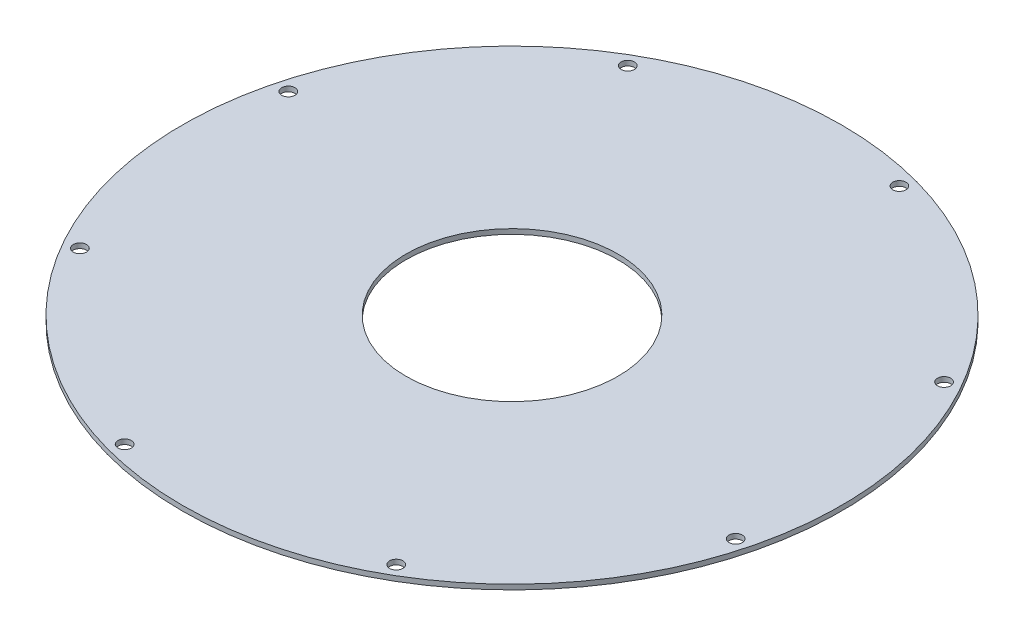
ISO-10303-21;
HEADER;
FILE_DESCRIPTION(('STEP AP214'),'2;1');
FILE_NAME('part.step','',(''),(''),'','','');
FILE_SCHEMA(('AUTOMOTIVE_DESIGN { 1 0 10303 214 1 1 1 1 }'));
ENDSEC;
DATA;
#1=APPLICATION_CONTEXT('core data for automotive mechanical design processes');
#2=APPLICATION_PROTOCOL_DEFINITION('international standard','automotive_design',2000,#1);
#3=PRODUCT_CONTEXT('',#1,'mechanical');
#4=PRODUCT('Part','Part','',(#3));
#5=PRODUCT_RELATED_PRODUCT_CATEGORY('part','',(#4));
#6=PRODUCT_DEFINITION_FORMATION('','',#4);
#7=PRODUCT_DEFINITION_CONTEXT('part definition',#1,'design');
#8=PRODUCT_DEFINITION('design','',#6,#7);
#9=PRODUCT_DEFINITION_SHAPE('','',#8);
#10=(LENGTH_UNIT() NAMED_UNIT(*) SI_UNIT(.MILLI.,.METRE.));
#11=(NAMED_UNIT(*) PLANE_ANGLE_UNIT() SI_UNIT($,.RADIAN.));
#12=(NAMED_UNIT(*) SI_UNIT($,.STERADIAN.) SOLID_ANGLE_UNIT());
#13=UNCERTAINTY_MEASURE_WITH_UNIT(LENGTH_MEASURE(1.E-05),#10,'distance_accuracy_value','');
#14=(GEOMETRIC_REPRESENTATION_CONTEXT(3) GLOBAL_UNCERTAINTY_ASSIGNED_CONTEXT((#13)) GLOBAL_UNIT_ASSIGNED_CONTEXT((#10,
#11,#12)) REPRESENTATION_CONTEXT('',''));
#15=CARTESIAN_POINT('',(0.,0.,0.));
#16=DIRECTION('',(0.,0.,1.));
#17=DIRECTION('',(1.,0.,0.));
#18=AXIS2_PLACEMENT_3D('',#15,#16,#17);
#19=CARTESIAN_POINT('',(0.,0.75,0.));
#20=DIRECTION('',(0.,1.,0.));
#21=DIRECTION('',(0.,0.,1.));
#22=AXIS2_PLACEMENT_3D('',#19,#20,#21);
#23=PLANE('',#22);
#24=CARTESIAN_POINT('',(-47.7500000000007,0.75,-82.7054260614135));
#25=DIRECTION('',(0.,1.,0.));
#26=DIRECTION('',(0.707106781186549,0.,0.707106781186546));
#27=AXIS2_PLACEMENT_3D('',#24,#25,#26);
#28=CIRCLE('',#27,1.99999999999998);
#29=CARTESIAN_POINT('',(-46.3357864376276,0.75,-81.2912124990404));
#30=VERTEX_POINT('',#29);
#31=EDGE_CURVE('E98',#30,#30,#28,.T.);
#32=ORIENTED_EDGE('',*,*,#31,.F.);
#33=EDGE_LOOP('',(#32));
#34=FACE_BOUND('',#33,.T.);
#35=CARTESIAN_POINT('',(-92.2459164106063,0.75,-24.7172188072898));
#36=DIRECTION('',(0.,1.,0.));
#37=DIRECTION('',(1.,0.,0.));
#38=AXIS2_PLACEMENT_3D('',#35,#36,#37);
#39=CIRCLE('',#38,1.99999999999998);
#40=CARTESIAN_POINT('',(-90.2459164106063,0.75,-24.7172188072898));
#41=VERTEX_POINT('',#40);
#42=EDGE_CURVE('E92',#41,#41,#39,.T.);
#43=ORIENTED_EDGE('',*,*,#42,.F.);
#44=EDGE_LOOP('',(#43));
#45=FACE_BOUND('',#44,.T.);
#46=CARTESIAN_POINT('',(-82.7054260614133,0.75,47.750000000001));
#47=DIRECTION('',(0.,1.,0.));
#48=DIRECTION('',(0.707106781186544,0.,-0.707106781186551));
#49=AXIS2_PLACEMENT_3D('',#46,#47,#48);
#50=CIRCLE('',#49,1.99999999999998);
#51=CARTESIAN_POINT('',(-81.2912124990403,0.75,46.3357864376279));
#52=VERTEX_POINT('',#51);
#53=EDGE_CURVE('E86',#52,#52,#50,.T.);
#54=ORIENTED_EDGE('',*,*,#53,.F.);
#55=EDGE_LOOP('',(#54));
#56=FACE_BOUND('',#55,.T.);
#57=CARTESIAN_POINT('',(-24.7172188072901,0.75,92.2459164106062));
#58=DIRECTION('',(0.,1.,0.));
#59=DIRECTION('',(0.,0.,-1.));
#60=AXIS2_PLACEMENT_3D('',#57,#58,#59);
#61=CIRCLE('',#60,1.99999999999998);
#62=CARTESIAN_POINT('',(-24.7172188072901,0.75,90.2459164106062));
#63=VERTEX_POINT('',#62);
#64=EDGE_CURVE('E80',#63,#63,#61,.T.);
#65=ORIENTED_EDGE('',*,*,#64,.F.);
#66=EDGE_LOOP('',(#65));
#67=FACE_BOUND('',#66,.T.);
#68=CARTESIAN_POINT('',(47.7500000000013,0.75,82.7054260614131));
#69=DIRECTION('',(0.,1.,0.));
#70=DIRECTION('',(-0.707106781186554,0.,-0.707106781186541));
#71=AXIS2_PLACEMENT_3D('',#68,#69,#70);
#72=CIRCLE('',#71,1.99999999999998);
#73=CARTESIAN_POINT('',(46.3357864376282,0.75,81.2912124990401));
#74=VERTEX_POINT('',#73);
#75=EDGE_CURVE('E74',#74,#74,#72,.T.);
#76=ORIENTED_EDGE('',*,*,#75,.F.);
#77=EDGE_LOOP('',(#76));
#78=FACE_BOUND('',#77,.T.);
#79=CARTESIAN_POINT('',(92.2459164106065,0.75,24.7172188072892));
#80=DIRECTION('',(0.,1.,0.));
#81=DIRECTION('',(-1.,0.,0.));
#82=AXIS2_PLACEMENT_3D('',#79,#80,#81);
#83=CIRCLE('',#82,1.99999999999998);
#84=CARTESIAN_POINT('',(90.2459164106065,0.75,24.7172188072892));
#85=VERTEX_POINT('',#84);
#86=EDGE_CURVE('E68',#85,#85,#83,.T.);
#87=ORIENTED_EDGE('',*,*,#86,.F.);
#88=EDGE_LOOP('',(#87));
#89=FACE_BOUND('',#88,.T.);
#90=CARTESIAN_POINT('',(82.705426061413,0.75,-47.7500000000016));
#91=DIRECTION('',(0.,1.,0.));
#92=DIRECTION('',(-0.707106781186539,0.,0.707106781186556));
#93=AXIS2_PLACEMENT_3D('',#90,#91,#92);
#94=CIRCLE('',#93,1.99999999999998);
#95=CARTESIAN_POINT('',(81.2912124990399,0.75,-46.3357864376285));
#96=VERTEX_POINT('',#95);
#97=EDGE_CURVE('E62',#96,#96,#94,.T.);
#98=ORIENTED_EDGE('',*,*,#97,.F.);
#99=EDGE_LOOP('',(#98));
#100=FACE_BOUND('',#99,.T.);
#101=CARTESIAN_POINT('',(24.7172188072901,0.75,-92.2459164106062));
#102=DIRECTION('',(0.,1.,0.));
#103=DIRECTION('',(0.,0.,1.));
#104=AXIS2_PLACEMENT_3D('',#101,#102,#103);
#105=CIRCLE('',#104,1.99999999999998);
#106=CARTESIAN_POINT('',(24.7172188072901,0.75,-90.2459164106062));
#107=VERTEX_POINT('',#106);
#108=EDGE_CURVE('E56',#107,#107,#105,.T.);
#109=ORIENTED_EDGE('',*,*,#108,.F.);
#110=EDGE_LOOP('',(#109));
#111=FACE_BOUND('',#110,.T.);
#112=CARTESIAN_POINT('',(0.,0.75,0.));
#113=DIRECTION('',(0.,1.,0.));
#114=DIRECTION('',(0.,0.,1.));
#115=AXIS2_PLACEMENT_3D('',#112,#113,#114);
#116=CIRCLE('',#115,99.5);
#117=CARTESIAN_POINT('',(0.,0.75,99.5));
#118=VERTEX_POINT('',#117);
#119=EDGE_CURVE('E10',#118,#118,#116,.T.);
#120=ORIENTED_EDGE('',*,*,#119,.T.);
#121=EDGE_LOOP('',(#120));
#122=FACE_BOUND('',#121,.T.);
#123=CARTESIAN_POINT('',(0.,0.75,0.));
#124=DIRECTION('',(0.,1.,0.));
#125=DIRECTION('',(0.,0.,1.));
#126=AXIS2_PLACEMENT_3D('',#123,#124,#125);
#127=CIRCLE('',#126,32.);
#128=CARTESIAN_POINT('',(0.,0.75,32.));
#129=VERTEX_POINT('',#128);
#130=EDGE_CURVE('E48',#129,#129,#127,.T.);
#131=ORIENTED_EDGE('',*,*,#130,.F.);
#132=EDGE_LOOP('',(#131));
#133=FACE_BOUND('',#132,.T.);
#134=ADVANCED_FACE('F37',(#34,#45,#56,#67,#78,#89,#100,#111,#122,#133),#23,.T.);
#135=CARTESIAN_POINT('',(0.,-0.75,0.));
#136=DIRECTION('',(0.,1.,0.));
#137=DIRECTION('',(0.,0.,1.));
#138=AXIS2_PLACEMENT_3D('',#135,#136,#137);
#139=PLANE('',#138);
#140=CARTESIAN_POINT('',(-47.7500000000007,-0.75,-82.7054260614135));
#141=DIRECTION('',(0.,1.,0.));
#142=DIRECTION('',(0.707106781186549,0.,0.707106781186546));
#143=AXIS2_PLACEMENT_3D('',#140,#141,#142);
#144=CIRCLE('',#143,1.99999999999998);
#145=CARTESIAN_POINT('',(-46.3357864376276,-0.75,-81.2912124990404));
#146=VERTEX_POINT('',#145);
#147=EDGE_CURVE('E59',#146,#146,#144,.T.);
#148=ORIENTED_EDGE('',*,*,#147,.T.);
#149=EDGE_LOOP('',(#148));
#150=FACE_BOUND('',#149,.T.);
#151=CARTESIAN_POINT('',(-92.2459164106063,-0.75,-24.7172188072898));
#152=DIRECTION('',(0.,1.,0.));
#153=DIRECTION('',(1.,0.,0.));
#154=AXIS2_PLACEMENT_3D('',#151,#152,#153);
#155=CIRCLE('',#154,1.99999999999998);
#156=CARTESIAN_POINT('',(-90.2459164106063,-0.75,-24.7172188072898));
#157=VERTEX_POINT('',#156);
#158=EDGE_CURVE('E95',#157,#157,#155,.T.);
#159=ORIENTED_EDGE('',*,*,#158,.T.);
#160=EDGE_LOOP('',(#159));
#161=FACE_BOUND('',#160,.T.);
#162=CARTESIAN_POINT('',(-82.7054260614133,-0.75,47.750000000001));
#163=DIRECTION('',(0.,1.,0.));
#164=DIRECTION('',(0.707106781186544,0.,-0.707106781186551));
#165=AXIS2_PLACEMENT_3D('',#162,#163,#164);
#166=CIRCLE('',#165,1.99999999999998);
#167=CARTESIAN_POINT('',(-81.2912124990403,-0.75,46.3357864376279));
#168=VERTEX_POINT('',#167);
#169=EDGE_CURVE('E89',#168,#168,#166,.T.);
#170=ORIENTED_EDGE('',*,*,#169,.T.);
#171=EDGE_LOOP('',(#170));
#172=FACE_BOUND('',#171,.T.);
#173=CARTESIAN_POINT('',(-24.7172188072901,-0.75,92.2459164106062));
#174=DIRECTION('',(0.,1.,0.));
#175=DIRECTION('',(0.,0.,-1.));
#176=AXIS2_PLACEMENT_3D('',#173,#174,#175);
#177=CIRCLE('',#176,1.99999999999998);
#178=CARTESIAN_POINT('',(-24.7172188072901,-0.75,90.2459164106062));
#179=VERTEX_POINT('',#178);
#180=EDGE_CURVE('E83',#179,#179,#177,.T.);
#181=ORIENTED_EDGE('',*,*,#180,.T.);
#182=EDGE_LOOP('',(#181));
#183=FACE_BOUND('',#182,.T.);
#184=CARTESIAN_POINT('',(47.7500000000013,-0.75,82.7054260614131));
#185=DIRECTION('',(0.,1.,0.));
#186=DIRECTION('',(-0.707106781186554,0.,-0.707106781186541));
#187=AXIS2_PLACEMENT_3D('',#184,#185,#186);
#188=CIRCLE('',#187,1.99999999999998);
#189=CARTESIAN_POINT('',(46.3357864376282,-0.75,81.2912124990401));
#190=VERTEX_POINT('',#189);
#191=EDGE_CURVE('E77',#190,#190,#188,.T.);
#192=ORIENTED_EDGE('',*,*,#191,.T.);
#193=EDGE_LOOP('',(#192));
#194=FACE_BOUND('',#193,.T.);
#195=CARTESIAN_POINT('',(92.2459164106065,-0.75,24.7172188072892));
#196=DIRECTION('',(0.,1.,0.));
#197=DIRECTION('',(-1.,0.,0.));
#198=AXIS2_PLACEMENT_3D('',#195,#196,#197);
#199=CIRCLE('',#198,1.99999999999998);
#200=CARTESIAN_POINT('',(90.2459164106065,-0.75,24.7172188072892));
#201=VERTEX_POINT('',#200);
#202=EDGE_CURVE('E71',#201,#201,#199,.T.);
#203=ORIENTED_EDGE('',*,*,#202,.T.);
#204=EDGE_LOOP('',(#203));
#205=FACE_BOUND('',#204,.T.);
#206=CARTESIAN_POINT('',(82.705426061413,-0.75,-47.7500000000016));
#207=DIRECTION('',(0.,1.,0.));
#208=DIRECTION('',(-0.707106781186539,0.,0.707106781186556));
#209=AXIS2_PLACEMENT_3D('',#206,#207,#208);
#210=CIRCLE('',#209,1.99999999999998);
#211=CARTESIAN_POINT('',(81.2912124990399,-0.75,-46.3357864376285));
#212=VERTEX_POINT('',#211);
#213=EDGE_CURVE('E65',#212,#212,#210,.T.);
#214=ORIENTED_EDGE('',*,*,#213,.T.);
#215=EDGE_LOOP('',(#214));
#216=FACE_BOUND('',#215,.T.);
#217=CARTESIAN_POINT('',(24.7172188072901,-0.75,-92.2459164106062));
#218=DIRECTION('',(0.,1.,0.));
#219=DIRECTION('',(0.,0.,1.));
#220=AXIS2_PLACEMENT_3D('',#217,#218,#219);
#221=CIRCLE('',#220,1.99999999999998);
#222=CARTESIAN_POINT('',(24.7172188072901,-0.75,-90.2459164106062));
#223=VERTEX_POINT('',#222);
#224=EDGE_CURVE('E53',#223,#223,#221,.T.);
#225=ORIENTED_EDGE('',*,*,#224,.T.);
#226=EDGE_LOOP('',(#225));
#227=FACE_BOUND('',#226,.T.);
#228=CARTESIAN_POINT('',(0.,-0.75,0.));
#229=DIRECTION('',(0.,1.,0.));
#230=DIRECTION('',(0.,0.,1.));
#231=AXIS2_PLACEMENT_3D('',#228,#229,#230);
#232=CIRCLE('',#231,99.5);
#233=CARTESIAN_POINT('',(0.,-0.75,99.5));
#234=VERTEX_POINT('',#233);
#235=EDGE_CURVE('E41',#234,#234,#232,.T.);
#236=ORIENTED_EDGE('',*,*,#235,.F.);
#237=EDGE_LOOP('',(#236));
#238=FACE_BOUND('',#237,.T.);
#239=CARTESIAN_POINT('',(0.,-0.75,0.));
#240=DIRECTION('',(0.,1.,0.));
#241=DIRECTION('',(0.,0.,1.));
#242=AXIS2_PLACEMENT_3D('',#239,#240,#241);
#243=CIRCLE('',#242,32.);
#244=CARTESIAN_POINT('',(0.,-0.75,32.));
#245=VERTEX_POINT('',#244);
#246=EDGE_CURVE('E50',#245,#245,#243,.T.);
#247=ORIENTED_EDGE('',*,*,#246,.T.);
#248=EDGE_LOOP('',(#247));
#249=FACE_BOUND('',#248,.T.);
#250=ADVANCED_FACE('F104',(#150,#161,#172,#183,#194,#205,#216,#227,#238,#249),#139,.F.);
#251=CARTESIAN_POINT('',(0.,0.75,0.));
#252=DIRECTION('',(0.,-1.,0.));
#253=DIRECTION('',(0.,0.,-1.));
#254=AXIS2_PLACEMENT_3D('',#251,#252,#253);
#255=CYLINDRICAL_SURFACE('',#254,99.5);
#256=ORIENTED_EDGE('',*,*,#119,.F.);
#257=EDGE_LOOP('',(#256));
#258=FACE_BOUND('',#257,.T.);
#259=ORIENTED_EDGE('',*,*,#235,.T.);
#260=EDGE_LOOP('',(#259));
#261=FACE_BOUND('',#260,.T.);
#262=ADVANCED_FACE('F39',(#258,#261),#255,.T.);
#263=CARTESIAN_POINT('',(0.,0.75,0.));
#264=DIRECTION('',(0.,-1.,0.));
#265=DIRECTION('',(0.,0.,-1.));
#266=AXIS2_PLACEMENT_3D('',#263,#264,#265);
#267=CYLINDRICAL_SURFACE('',#266,32.);
#268=ORIENTED_EDGE('',*,*,#130,.T.);
#269=EDGE_LOOP('',(#268));
#270=FACE_BOUND('',#269,.T.);
#271=ORIENTED_EDGE('',*,*,#246,.F.);
#272=EDGE_LOOP('',(#271));
#273=FACE_BOUND('',#272,.T.);
#274=ADVANCED_FACE('F133',(#270,#273),#267,.F.);
#275=CARTESIAN_POINT('',(24.7172188072901,-0.75,-92.2459164106062));
#276=DIRECTION('',(0.,1.,0.));
#277=DIRECTION('',(0.,0.,1.));
#278=AXIS2_PLACEMENT_3D('',#275,#276,#277);
#279=CYLINDRICAL_SURFACE('',#278,1.99999999999998);
#280=ORIENTED_EDGE('',*,*,#224,.F.);
#281=EDGE_LOOP('',(#280));
#282=FACE_BOUND('',#281,.T.);
#283=ORIENTED_EDGE('',*,*,#108,.T.);
#284=EDGE_LOOP('',(#283));
#285=FACE_BOUND('',#284,.T.);
#286=ADVANCED_FACE('F136',(#282,#285),#279,.F.);
#287=CARTESIAN_POINT('',(82.705426061413,-0.75,-47.7500000000016));
#288=DIRECTION('',(0.,1.,0.));
#289=DIRECTION('',(0.,0.,1.));
#290=AXIS2_PLACEMENT_3D('',#287,#288,#289);
#291=CYLINDRICAL_SURFACE('',#290,1.99999999999998);
#292=ORIENTED_EDGE('',*,*,#213,.F.);
#293=EDGE_LOOP('',(#292));
#294=FACE_BOUND('',#293,.T.);
#295=ORIENTED_EDGE('',*,*,#97,.T.);
#296=EDGE_LOOP('',(#295));
#297=FACE_BOUND('',#296,.T.);
#298=ADVANCED_FACE('F148',(#294,#297),#291,.F.);
#299=CARTESIAN_POINT('',(92.2459164106065,-0.75,24.7172188072892));
#300=DIRECTION('',(0.,1.,0.));
#301=DIRECTION('',(0.,0.,1.));
#302=AXIS2_PLACEMENT_3D('',#299,#300,#301);
#303=CYLINDRICAL_SURFACE('',#302,1.99999999999998);
#304=ORIENTED_EDGE('',*,*,#202,.F.);
#305=EDGE_LOOP('',(#304));
#306=FACE_BOUND('',#305,.T.);
#307=ORIENTED_EDGE('',*,*,#86,.T.);
#308=EDGE_LOOP('',(#307));
#309=FACE_BOUND('',#308,.T.);
#310=ADVANCED_FACE('F152',(#306,#309),#303,.F.);
#311=CARTESIAN_POINT('',(47.7500000000013,-0.75,82.7054260614131));
#312=DIRECTION('',(0.,1.,0.));
#313=DIRECTION('',(0.,0.,1.));
#314=AXIS2_PLACEMENT_3D('',#311,#312,#313);
#315=CYLINDRICAL_SURFACE('',#314,1.99999999999998);
#316=ORIENTED_EDGE('',*,*,#191,.F.);
#317=EDGE_LOOP('',(#316));
#318=FACE_BOUND('',#317,.T.);
#319=ORIENTED_EDGE('',*,*,#75,.T.);
#320=EDGE_LOOP('',(#319));
#321=FACE_BOUND('',#320,.T.);
#322=ADVANCED_FACE('F156',(#318,#321),#315,.F.);
#323=CARTESIAN_POINT('',(-24.7172188072901,-0.75,92.2459164106062));
#324=DIRECTION('',(0.,1.,0.));
#325=DIRECTION('',(0.,0.,1.));
#326=AXIS2_PLACEMENT_3D('',#323,#324,#325);
#327=CYLINDRICAL_SURFACE('',#326,1.99999999999998);
#328=ORIENTED_EDGE('',*,*,#180,.F.);
#329=EDGE_LOOP('',(#328));
#330=FACE_BOUND('',#329,.T.);
#331=ORIENTED_EDGE('',*,*,#64,.T.);
#332=EDGE_LOOP('',(#331));
#333=FACE_BOUND('',#332,.T.);
#334=ADVANCED_FACE('F160',(#330,#333),#327,.F.);
#335=CARTESIAN_POINT('',(-82.7054260614133,-0.75,47.750000000001));
#336=DIRECTION('',(0.,1.,0.));
#337=DIRECTION('',(0.,0.,1.));
#338=AXIS2_PLACEMENT_3D('',#335,#336,#337);
#339=CYLINDRICAL_SURFACE('',#338,1.99999999999998);
#340=ORIENTED_EDGE('',*,*,#169,.F.);
#341=EDGE_LOOP('',(#340));
#342=FACE_BOUND('',#341,.T.);
#343=ORIENTED_EDGE('',*,*,#53,.T.);
#344=EDGE_LOOP('',(#343));
#345=FACE_BOUND('',#344,.T.);
#346=ADVANCED_FACE('F164',(#342,#345),#339,.F.);
#347=CARTESIAN_POINT('',(-92.2459164106063,-0.75,-24.7172188072898));
#348=DIRECTION('',(0.,1.,0.));
#349=DIRECTION('',(0.,0.,1.));
#350=AXIS2_PLACEMENT_3D('',#347,#348,#349);
#351=CYLINDRICAL_SURFACE('',#350,1.99999999999998);
#352=ORIENTED_EDGE('',*,*,#158,.F.);
#353=EDGE_LOOP('',(#352));
#354=FACE_BOUND('',#353,.T.);
#355=ORIENTED_EDGE('',*,*,#42,.T.);
#356=EDGE_LOOP('',(#355));
#357=FACE_BOUND('',#356,.T.);
#358=ADVANCED_FACE('F110',(#354,#357),#351,.F.);
#359=CARTESIAN_POINT('',(-47.7500000000007,-0.75,-82.7054260614135));
#360=DIRECTION('',(0.,1.,0.));
#361=DIRECTION('',(0.,0.,1.));
#362=AXIS2_PLACEMENT_3D('',#359,#360,#361);
#363=CYLINDRICAL_SURFACE('',#362,1.99999999999998);
#364=ORIENTED_EDGE('',*,*,#147,.F.);
#365=EDGE_LOOP('',(#364));
#366=FACE_BOUND('',#365,.T.);
#367=ORIENTED_EDGE('',*,*,#31,.T.);
#368=EDGE_LOOP('',(#367));
#369=FACE_BOUND('',#368,.T.);
#370=ADVANCED_FACE('F107',(#366,#369),#363,.F.);
#371=CLOSED_SHELL('',(#134,#250,#262,#274,#286,#298,#310,#322,#334,#346,#358,#370));
#372=MANIFOLD_SOLID_BREP('B2',#371);
#373=ADVANCED_BREP_SHAPE_REPRESENTATION('',(#18,#372),#14);
#374=SHAPE_DEFINITION_REPRESENTATION(#9,#373);
ENDSEC;
END-ISO-10303-21;
